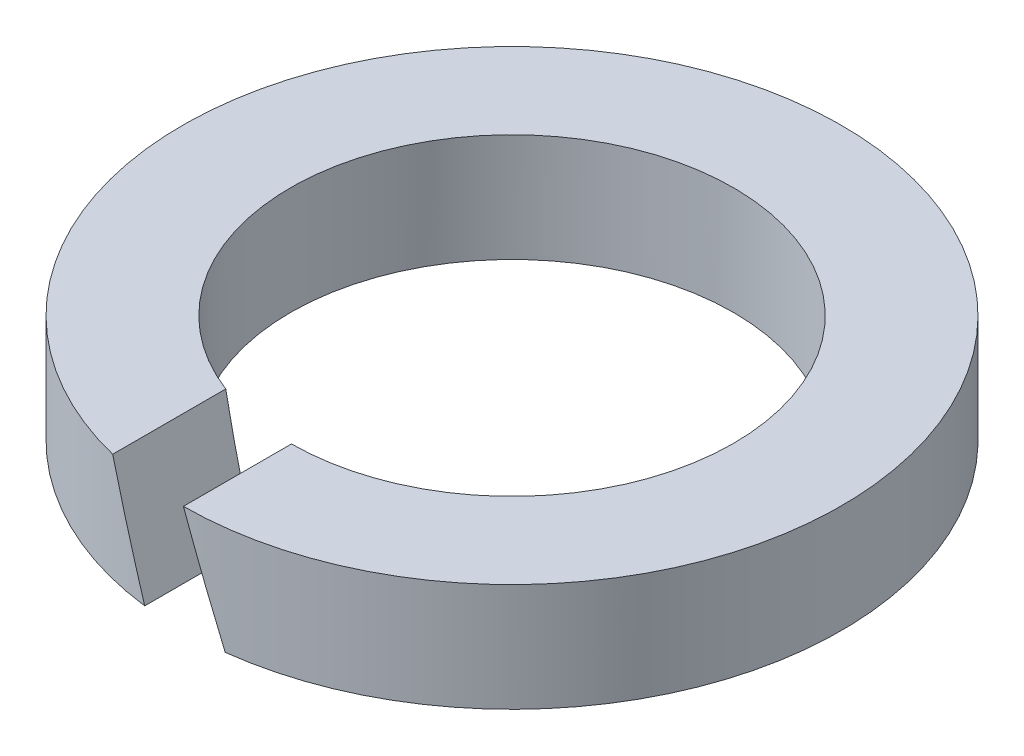
ISO-10303-21;
HEADER;
FILE_DESCRIPTION(('STEP AP214'),'2;1');
FILE_NAME('part.step','',(''),(''),'','','');
FILE_SCHEMA(('AUTOMOTIVE_DESIGN { 1 0 10303 214 1 1 1 1 }'));
ENDSEC;
DATA;
#1=APPLICATION_CONTEXT('core data for automotive mechanical design processes');
#2=APPLICATION_PROTOCOL_DEFINITION('international standard','automotive_design',2000,#1);
#3=PRODUCT_CONTEXT('',#1,'mechanical');
#4=PRODUCT('Part','Part','',(#3));
#5=PRODUCT_RELATED_PRODUCT_CATEGORY('part','',(#4));
#6=PRODUCT_DEFINITION_FORMATION('','',#4);
#7=PRODUCT_DEFINITION_CONTEXT('part definition',#1,'design');
#8=PRODUCT_DEFINITION('design','',#6,#7);
#9=PRODUCT_DEFINITION_SHAPE('','',#8);
#10=(LENGTH_UNIT() NAMED_UNIT(*) SI_UNIT(.MILLI.,.METRE.));
#11=(NAMED_UNIT(*) PLANE_ANGLE_UNIT() SI_UNIT($,.RADIAN.));
#12=(NAMED_UNIT(*) SI_UNIT($,.STERADIAN.) SOLID_ANGLE_UNIT());
#13=UNCERTAINTY_MEASURE_WITH_UNIT(LENGTH_MEASURE(1.E-05),#10,'distance_accuracy_value','');
#14=(GEOMETRIC_REPRESENTATION_CONTEXT(3) GLOBAL_UNCERTAINTY_ASSIGNED_CONTEXT((#13)) GLOBAL_UNIT_ASSIGNED_CONTEXT((#10,
#11,#12)) REPRESENTATION_CONTEXT('',''));
#15=CARTESIAN_POINT('',(0.,0.,0.));
#16=DIRECTION('',(0.,0.,1.));
#17=DIRECTION('',(1.,0.,0.));
#18=AXIS2_PLACEMENT_3D('',#15,#16,#17);
#19=CARTESIAN_POINT('',(0.,15.7596723055964,0.));
#20=DIRECTION('',(0.,1.,0.));
#21=DIRECTION('',(0.,0.,1.));
#22=AXIS2_PLACEMENT_3D('',#19,#20,#21);
#23=CYLINDRICAL_SURFACE('',#22,2.05);
#24=CARTESIAN_POINT('',(0.,0.,0.));
#25=DIRECTION('',(0.,1.,0.));
#26=DIRECTION('',(0.,0.,1.));
#27=AXIS2_PLACEMENT_3D('',#24,#25,#26);
#28=CIRCLE('',#27,2.05);
#29=CARTESIAN_POINT('',(0.37246222036657,0.,2.01587993055132));
#30=VERTEX_POINT('',#29);
#31=CARTESIAN_POINT('',(-0.372462220366569,0.,2.01587993055132));
#32=VERTEX_POINT('',#31);
#33=EDGE_CURVE('E91',#30,#32,#28,.T.);
#34=ORIENTED_EDGE('',*,*,#33,.F.);
#35=CARTESIAN_POINT('',(0.,1.02333154005709,0.));
#36=DIRECTION('',(-0.939692620785909,-0.342020143325667,0.));
#37=DIRECTION('',(-0.342020143325667,0.939692620785909,0.));
#38=AXIS2_PLACEMENT_3D('',#35,#36,#37);
#39=ELLIPSE('',#38,5.99379902033436,2.05);
#40=CARTESIAN_POINT('',(0.00849198610036997,0.999999999999999,2.04998241118602));
#41=VERTEX_POINT('',#40);
#42=EDGE_CURVE('E56',#41,#30,#39,.F.);
#43=ORIENTED_EDGE('',*,*,#42,.F.);
#44=CARTESIAN_POINT('',(0.,0.999999999999999,0.));
#45=DIRECTION('',(0.,1.,0.));
#46=DIRECTION('',(0.,0.,1.));
#47=AXIS2_PLACEMENT_3D('',#44,#45,#46);
#48=CIRCLE('',#47,2.05);
#49=CARTESIAN_POINT('',(-0.736432454632768,0.999999999999998,1.913156355284));
#50=VERTEX_POINT('',#49);
#51=EDGE_CURVE('E11',#41,#50,#48,.T.);
#52=ORIENTED_EDGE('',*,*,#51,.T.);
#53=CARTESIAN_POINT('',(0.,-1.02333154005709,0.));
#54=DIRECTION('',(0.939692620785909,0.342020143325666,0.));
#55=DIRECTION('',(-0.342020143325666,0.939692620785909,0.));
#56=AXIS2_PLACEMENT_3D('',#53,#54,#55);
#57=ELLIPSE('',#56,5.99379902033437,2.05);
#58=EDGE_CURVE('E88',#32,#50,#57,.F.);
#59=ORIENTED_EDGE('',*,*,#58,.F.);
#60=EDGE_LOOP('',(#34,#43,#52,#59));
#61=FACE_BOUND('',#60,.T.);
#62=ADVANCED_FACE('F34',(#61),#23,.F.);
#63=CARTESIAN_POINT('',(-2.05,1.,0.));
#64=DIRECTION('',(0.,1.,0.));
#65=DIRECTION('',(0.,0.,1.));
#66=AXIS2_PLACEMENT_3D('',#63,#64,#65);
#67=PLANE('',#66);
#68=ORIENTED_EDGE('',*,*,#51,.F.);
#69=DIRECTION('',(0.,0.,-1.));
#70=VECTOR('',#69,1.);
#71=CARTESIAN_POINT('',(0.00849198610036997,0.999999999999999,3.051));
#72=LINE('',#71,#70);
#73=CARTESIAN_POINT('',(0.00849198610036997,0.999999999999999,3.04998817803808));
#74=VERTEX_POINT('',#73);
#75=EDGE_CURVE('E93',#74,#41,#72,.T.);
#76=ORIENTED_EDGE('',*,*,#75,.F.);
#77=CARTESIAN_POINT('',(0.,0.999999999999999,0.));
#78=DIRECTION('',(0.,1.,0.));
#79=DIRECTION('',(0.,0.,1.));
#80=AXIS2_PLACEMENT_3D('',#77,#78,#79);
#81=CIRCLE('',#80,3.05);
#82=CARTESIAN_POINT('',(-0.736432454632768,0.999999999999998,2.95975796979475));
#83=VERTEX_POINT('',#82);
#84=EDGE_CURVE('E41',#74,#83,#81,.T.);
#85=ORIENTED_EDGE('',*,*,#84,.T.);
#86=DIRECTION('',(0.,0.,-1.));
#87=VECTOR('',#86,1.);
#88=CARTESIAN_POINT('',(-0.736432454632768,0.999999999999998,3.051));
#89=LINE('',#88,#87);
#90=EDGE_CURVE('E97',#83,#50,#89,.T.);
#91=ORIENTED_EDGE('',*,*,#90,.T.);
#92=EDGE_LOOP('',(#68,#76,#85,#91));
#93=FACE_BOUND('',#92,.T.);
#94=ADVANCED_FACE('F108',(#93),#67,.T.);
#95=CARTESIAN_POINT('',(0.,15.7596723055964,0.));
#96=DIRECTION('',(0.,1.,0.));
#97=DIRECTION('',(0.,0.,1.));
#98=AXIS2_PLACEMENT_3D('',#95,#96,#97);
#99=CYLINDRICAL_SURFACE('',#98,3.05);
#100=ORIENTED_EDGE('',*,*,#84,.F.);
#101=CARTESIAN_POINT('',(0.,1.02333154005709,0.));
#102=DIRECTION('',(-0.939692620785909,-0.342020143325667,0.));
#103=DIRECTION('',(-0.342020143325667,0.939692620785909,0.));
#104=AXIS2_PLACEMENT_3D('',#101,#102,#103);
#105=ELLIPSE('',#104,8.91760342049747,3.05);
#106=CARTESIAN_POINT('',(0.372462220366569,0.,3.02717226044366));
#107=VERTEX_POINT('',#106);
#108=EDGE_CURVE('E74',#107,#74,#105,.T.);
#109=ORIENTED_EDGE('',*,*,#108,.F.);
#110=CARTESIAN_POINT('',(0.,0.,0.));
#111=DIRECTION('',(0.,1.,0.));
#112=DIRECTION('',(0.,0.,1.));
#113=AXIS2_PLACEMENT_3D('',#110,#111,#112);
#114=CIRCLE('',#113,3.05);
#115=CARTESIAN_POINT('',(-0.372462220366569,0.,3.02717226044366));
#116=VERTEX_POINT('',#115);
#117=EDGE_CURVE('E86',#107,#116,#114,.T.);
#118=ORIENTED_EDGE('',*,*,#117,.T.);
#119=CARTESIAN_POINT('',(0.,-1.02333154005709,0.));
#120=DIRECTION('',(0.939692620785909,0.342020143325666,0.));
#121=DIRECTION('',(-0.342020143325666,0.939692620785909,0.));
#122=AXIS2_PLACEMENT_3D('',#119,#120,#121);
#123=ELLIPSE('',#122,8.91760342049748,3.05);
#124=EDGE_CURVE('E48',#83,#116,#123,.T.);
#125=ORIENTED_EDGE('',*,*,#124,.F.);
#126=EDGE_LOOP('',(#100,#109,#118,#125));
#127=FACE_BOUND('',#126,.T.);
#128=ADVANCED_FACE('F85',(#127),#99,.T.);
#129=CARTESIAN_POINT('',(-2.05,0.,0.));
#130=DIRECTION('',(0.,-1.,0.));
#131=DIRECTION('',(0.,0.,-1.));
#132=AXIS2_PLACEMENT_3D('',#129,#130,#131);
#133=PLANE('',#132);
#134=ORIENTED_EDGE('',*,*,#117,.F.);
#135=DIRECTION('',(0.,0.,-1.));
#136=VECTOR('',#135,1.);
#137=CARTESIAN_POINT('',(0.372462220366569,0.,3.051));
#138=LINE('',#137,#136);
#139=EDGE_CURVE('E71',#107,#30,#138,.T.);
#140=ORIENTED_EDGE('',*,*,#139,.T.);
#141=ORIENTED_EDGE('',*,*,#33,.T.);
#142=DIRECTION('',(0.,0.,-1.));
#143=VECTOR('',#142,1.);
#144=CARTESIAN_POINT('',(-0.372462220366569,0.,3.051));
#145=LINE('',#144,#143);
#146=EDGE_CURVE('E80',#116,#32,#145,.T.);
#147=ORIENTED_EDGE('',*,*,#146,.F.);
#148=EDGE_LOOP('',(#134,#140,#141,#147));
#149=FACE_BOUND('',#148,.T.);
#150=ADVANCED_FACE('F90',(#149),#133,.T.);
#151=CARTESIAN_POINT('',(-0.736432454632768,0.999999999999998,3.051));
#152=DIRECTION('',(0.939692620785909,0.342020143325666,0.));
#153=DIRECTION('',(-0.342020143325666,0.939692620785909,0.));
#154=AXIS2_PLACEMENT_3D('',#151,#152,#153);
#155=PLANE('',#154);
#156=ORIENTED_EDGE('',*,*,#58,.T.);
#157=ORIENTED_EDGE('',*,*,#90,.F.);
#158=ORIENTED_EDGE('',*,*,#124,.T.);
#159=ORIENTED_EDGE('',*,*,#146,.T.);
#160=EDGE_LOOP('',(#156,#157,#158,#159));
#161=FACE_BOUND('',#160,.T.);
#162=ADVANCED_FACE('F104',(#161),#155,.T.);
#163=CARTESIAN_POINT('',(0.00849198610036997,0.999999999999999,3.051));
#164=DIRECTION('',(-0.939692620785909,-0.342020143325667,0.));
#165=DIRECTION('',(0.342020143325667,-0.939692620785909,0.));
#166=AXIS2_PLACEMENT_3D('',#163,#164,#165);
#167=PLANE('',#166);
#168=ORIENTED_EDGE('',*,*,#42,.T.);
#169=ORIENTED_EDGE('',*,*,#139,.F.);
#170=ORIENTED_EDGE('',*,*,#108,.T.);
#171=ORIENTED_EDGE('',*,*,#75,.T.);
#172=EDGE_LOOP('',(#168,#169,#170,#171));
#173=FACE_BOUND('',#172,.T.);
#174=ADVANCED_FACE('F73',(#173),#167,.T.);
#175=CLOSED_SHELL('',(#62,#94,#128,#150,#162,#174));
#176=MANIFOLD_SOLID_BREP('B2',#175);
#177=ADVANCED_BREP_SHAPE_REPRESENTATION('',(#18,#176),#14);
#178=SHAPE_DEFINITION_REPRESENTATION(#9,#177);
ENDSEC;
END-ISO-10303-21;
